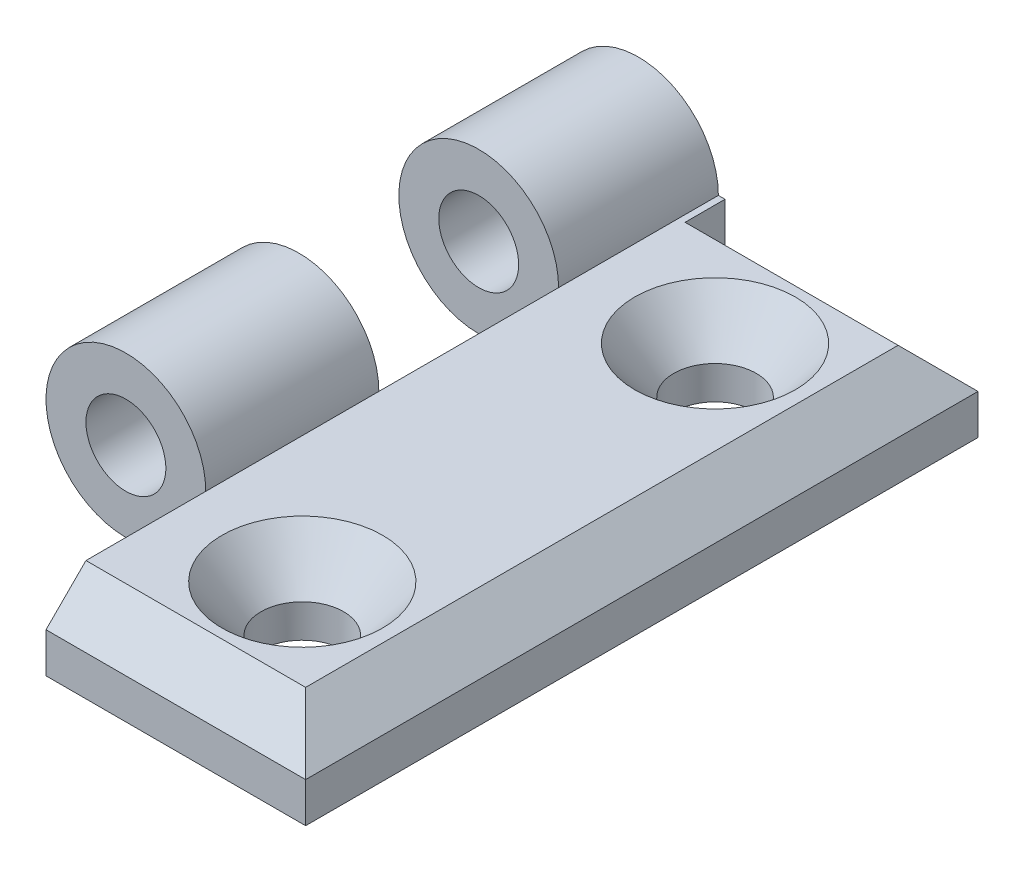
ISO-10303-21;
HEADER;
FILE_DESCRIPTION(('STEP AP214'),'2;1');
FILE_NAME('part.step','',(''),(''),'','','');
FILE_SCHEMA(('AUTOMOTIVE_DESIGN { 1 0 10303 214 1 1 1 1 }'));
ENDSEC;
DATA;
#1=APPLICATION_CONTEXT('core data for automotive mechanical design processes');
#2=APPLICATION_PROTOCOL_DEFINITION('international standard','automotive_design',2000,#1);
#3=PRODUCT_CONTEXT('',#1,'mechanical');
#4=PRODUCT('Part','Part','',(#3));
#5=PRODUCT_RELATED_PRODUCT_CATEGORY('part','',(#4));
#6=PRODUCT_DEFINITION_FORMATION('','',#4);
#7=PRODUCT_DEFINITION_CONTEXT('part definition',#1,'design');
#8=PRODUCT_DEFINITION('design','',#6,#7);
#9=PRODUCT_DEFINITION_SHAPE('','',#8);
#10=(LENGTH_UNIT() NAMED_UNIT(*) SI_UNIT(.MILLI.,.METRE.));
#11=(NAMED_UNIT(*) PLANE_ANGLE_UNIT() SI_UNIT($,.RADIAN.));
#12=(NAMED_UNIT(*) SI_UNIT($,.STERADIAN.) SOLID_ANGLE_UNIT());
#13=UNCERTAINTY_MEASURE_WITH_UNIT(LENGTH_MEASURE(1.E-05),#10,'distance_accuracy_value','');
#14=(GEOMETRIC_REPRESENTATION_CONTEXT(3) GLOBAL_UNCERTAINTY_ASSIGNED_CONTEXT((#13)) GLOBAL_UNIT_ASSIGNED_CONTEXT((#10,
#11,#12)) REPRESENTATION_CONTEXT('',''));
#15=CARTESIAN_POINT('',(0.,0.,0.));
#16=DIRECTION('',(0.,0.,1.));
#17=DIRECTION('',(1.,0.,0.));
#18=AXIS2_PLACEMENT_3D('',#15,#16,#17);
#19=CARTESIAN_POINT('',(0.,6.,50.5));
#20=DIRECTION('',(0.,-1.,0.));
#21=DIRECTION('',(0.,0.,-1.));
#22=AXIS2_PLACEMENT_3D('',#19,#20,#21);
#23=PLANE('',#22);
#24=DIRECTION('',(0.,0.,-1.));
#25=VECTOR('',#24,1.);
#26=CARTESIAN_POINT('',(6.00000000000001,6.,50.5));
#27=LINE('',#26,#25);
#28=CARTESIAN_POINT('',(6.00000000000001,6.,47.5));
#29=VERTEX_POINT('',#28);
#30=CARTESIAN_POINT('',(6.00000000000001,6.,38.5));
#31=VERTEX_POINT('',#30);
#32=EDGE_CURVE('E169',#29,#31,#27,.T.);
#33=ORIENTED_EDGE('',*,*,#32,.F.);
#34=DIRECTION('',(1.,0.,0.));
#35=VECTOR('',#34,1.);
#36=CARTESIAN_POINT('',(25.5,6.,47.5));
#37=LINE('',#36,#35);
#38=CARTESIAN_POINT('',(22.5,6.,47.5));
#39=VERTEX_POINT('',#38);
#40=EDGE_CURVE('E54',#29,#39,#37,.T.);
#41=ORIENTED_EDGE('',*,*,#40,.T.);
#42=DIRECTION('',(0.,0.,-1.));
#43=VECTOR('',#42,1.);
#44=CARTESIAN_POINT('',(22.5,6.,50.5));
#45=LINE('',#44,#43);
#46=CARTESIAN_POINT('',(22.5,6.,3.));
#47=VERTEX_POINT('',#46);
#48=EDGE_CURVE('E58',#39,#47,#45,.T.);
#49=ORIENTED_EDGE('',*,*,#48,.T.);
#50=DIRECTION('',(-1.,0.,0.));
#51=VECTOR('',#50,1.);
#52=CARTESIAN_POINT('',(57.,6.,3.));
#53=LINE('',#52,#51);
#54=CARTESIAN_POINT('',(6.5,6.,3.));
#55=VERTEX_POINT('',#54);
#56=EDGE_CURVE('E138',#47,#55,#53,.T.);
#57=ORIENTED_EDGE('',*,*,#56,.T.);
#58=DIRECTION('',(0.,0.,1.));
#59=VECTOR('',#58,1.);
#60=CARTESIAN_POINT('',(6.5,6.,0.));
#61=LINE('',#60,#59);
#62=CARTESIAN_POINT('',(6.5,6.,0.));
#63=VERTEX_POINT('',#62);
#64=EDGE_CURVE('E126',#63,#55,#61,.T.);
#65=ORIENTED_EDGE('',*,*,#64,.F.);
#66=DIRECTION('',(-1.,0.,0.));
#67=VECTOR('',#66,1.);
#68=CARTESIAN_POINT('',(0.,6.,0.));
#69=LINE('',#68,#67);
#70=CARTESIAN_POINT('',(6.00000000000001,6.,0.));
#71=VERTEX_POINT('',#70);
#72=EDGE_CURVE('E136',#63,#71,#69,.T.);
#73=ORIENTED_EDGE('',*,*,#72,.T.);
#74=CARTESIAN_POINT('',(6.00000000000001,6.,12.));
#75=VERTEX_POINT('',#74);
#76=EDGE_CURVE('E173',#75,#71,#27,.T.);
#77=ORIENTED_EDGE('',*,*,#76,.F.);
#78=DIRECTION('',(0.,0.,-1.));
#79=VECTOR('',#78,1.);
#80=CARTESIAN_POINT('',(6.,6.,50.5));
#81=LINE('',#80,#79);
#82=CARTESIAN_POINT('',(6.,6.,25.5));
#83=VERTEX_POINT('',#82);
#84=EDGE_CURVE('E196',#83,#75,#81,.T.);
#85=ORIENTED_EDGE('',*,*,#84,.F.);
#86=EDGE_CURVE('E172',#31,#83,#27,.T.);
#87=ORIENTED_EDGE('',*,*,#86,.F.);
#88=EDGE_LOOP('',(#33,#41,#49,#57,#65,#73,#77,#85,#87));
#89=FACE_BOUND('',#88,.T.);
#90=CARTESIAN_POINT('',(15.5,6.,9.75));
#91=DIRECTION('',(0.,-1.,0.));
#92=DIRECTION('',(0.,0.,-1.));
#93=AXIS2_PLACEMENT_3D('',#90,#91,#92);
#94=CIRCLE('',#93,6.03684870912049);
#95=CARTESIAN_POINT('',(15.5,6.,3.71315129087951));
#96=VERTEX_POINT('',#95);
#97=EDGE_CURVE('E221',#96,#96,#94,.F.);
#98=ORIENTED_EDGE('',*,*,#97,.F.);
#99=EDGE_LOOP('',(#98));
#100=FACE_BOUND('',#99,.T.);
#101=CARTESIAN_POINT('',(15.5,6.,40.75));
#102=DIRECTION('',(0.,-1.,0.));
#103=DIRECTION('',(0.,0.,-1.));
#104=AXIS2_PLACEMENT_3D('',#101,#102,#103);
#105=CIRCLE('',#104,6.03684870912049);
#106=CARTESIAN_POINT('',(15.5,6.,34.7131512908795));
#107=VERTEX_POINT('',#106);
#108=EDGE_CURVE('E343',#107,#107,#105,.T.);
#109=ORIENTED_EDGE('',*,*,#108,.T.);
#110=EDGE_LOOP('',(#109));
#111=FACE_BOUND('',#110,.T.);
#112=ADVANCED_FACE('F38',(#89,#100,#111),#23,.F.);
#113=CARTESIAN_POINT('',(15.5,-1.2E-05,9.75));
#114=DIRECTION('',(0.,1.,0.));
#115=DIRECTION('',(0.,0.,1.));
#116=AXIS2_PLACEMENT_3D('',#113,#114,#115);
#117=CYLINDRICAL_SURFACE('',#116,3.1);
#118=CARTESIAN_POINT('',(15.5,0.,9.75));
#119=DIRECTION('',(0.,-1.,0.));
#120=DIRECTION('',(1.,0.,0.));
#121=AXIS2_PLACEMENT_3D('',#118,#119,#120);
#122=CIRCLE('',#121,3.1);
#123=CARTESIAN_POINT('',(15.5,0.,12.85));
#124=VERTEX_POINT('',#123);
#125=EDGE_CURVE('E150',#124,#124,#122,.T.);
#126=CARTESIAN_POINT('',(15.5,2.5,9.75));
#127=DIRECTION('',(0.,1.,0.));
#128=DIRECTION('',(0.,0.,1.));
#129=AXIS2_PLACEMENT_3D('',#126,#127,#128);
#130=CIRCLE('',#129,3.1);
#131=CARTESIAN_POINT('',(15.5,2.5,12.85));
#132=VERTEX_POINT('',#131);
#133=EDGE_CURVE('E340',#132,#132,#130,.T.);
#134=CARTESIAN_POINT('',(15.5,0.,12.85));
#135=CARTESIAN_POINT('',(15.5,0.0260416666666648,12.85));
#136=CARTESIAN_POINT('',(15.5,0.0520833333333315,12.85));
#137=CARTESIAN_POINT('',(15.5,0.104166666666665,12.85));
#138=CARTESIAN_POINT('',(15.5,0.130208333333332,12.85));
#139=CARTESIAN_POINT('',(15.5,0.182291666666665,12.85));
#140=CARTESIAN_POINT('',(15.5,0.208333333333332,12.85));
#141=CARTESIAN_POINT('',(15.5,0.260416666666665,12.85));
#142=CARTESIAN_POINT('',(15.5,0.286458333333332,12.85));
#143=CARTESIAN_POINT('',(15.5,0.338541666666665,12.85));
#144=CARTESIAN_POINT('',(15.5,0.364583333333332,12.85));
#145=CARTESIAN_POINT('',(15.5,0.416666666666665,12.85));
#146=CARTESIAN_POINT('',(15.5,0.442708333333332,12.85));
#147=CARTESIAN_POINT('',(15.5,0.494791666666665,12.85));
#148=CARTESIAN_POINT('',(15.5,0.520833333333332,12.85));
#149=CARTESIAN_POINT('',(15.5,0.572916666666665,12.85));
#150=CARTESIAN_POINT('',(15.5,0.598958333333332,12.85));
#151=CARTESIAN_POINT('',(15.5,0.651041666666665,12.85));
#152=CARTESIAN_POINT('',(15.5,0.677083333333332,12.85));
#153=CARTESIAN_POINT('',(15.5,0.729166666666665,12.85));
#154=CARTESIAN_POINT('',(15.5,0.755208333333332,12.85));
#155=CARTESIAN_POINT('',(15.5,0.807291666666666,12.85));
#156=CARTESIAN_POINT('',(15.5,0.833333333333332,12.85));
#157=CARTESIAN_POINT('',(15.5,0.885416666666666,12.85));
#158=CARTESIAN_POINT('',(15.5,0.911458333333332,12.85));
#159=CARTESIAN_POINT('',(15.5,0.963541666666666,12.85));
#160=CARTESIAN_POINT('',(15.5,0.989583333333332,12.85));
#161=CARTESIAN_POINT('',(15.5,1.04166666666667,12.85));
#162=CARTESIAN_POINT('',(15.5,1.06770833333333,12.85));
#163=CARTESIAN_POINT('',(15.5,1.11979166666667,12.85));
#164=CARTESIAN_POINT('',(15.5,1.14583333333333,12.85));
#165=CARTESIAN_POINT('',(15.5,1.19791666666667,12.85));
#166=CARTESIAN_POINT('',(15.5,1.22395833333333,12.85));
#167=CARTESIAN_POINT('',(15.5,1.27604166666667,12.85));
#168=CARTESIAN_POINT('',(15.5,1.30208333333333,12.85));
#169=CARTESIAN_POINT('',(15.5,1.35416666666667,12.85));
#170=CARTESIAN_POINT('',(15.5,1.38020833333333,12.85));
#171=CARTESIAN_POINT('',(15.5,1.43229166666667,12.85));
#172=CARTESIAN_POINT('',(15.5,1.45833333333333,12.85));
#173=CARTESIAN_POINT('',(15.5,1.51041666666667,12.85));
#174=CARTESIAN_POINT('',(15.5,1.53645833333333,12.85));
#175=CARTESIAN_POINT('',(15.5,1.58854166666667,12.85));
#176=CARTESIAN_POINT('',(15.5,1.61458333333333,12.85));
#177=CARTESIAN_POINT('',(15.5,1.66666666666667,12.85));
#178=CARTESIAN_POINT('',(15.5,1.69270833333333,12.85));
#179=CARTESIAN_POINT('',(15.5,1.74479166666667,12.85));
#180=CARTESIAN_POINT('',(15.5,1.77083333333333,12.85));
#181=CARTESIAN_POINT('',(15.5,1.82291666666667,12.85));
#182=CARTESIAN_POINT('',(15.5,1.84895833333333,12.85));
#183=CARTESIAN_POINT('',(15.5,1.90104166666667,12.85));
#184=CARTESIAN_POINT('',(15.5,1.92708333333333,12.85));
#185=CARTESIAN_POINT('',(15.5,1.97916666666667,12.85));
#186=CARTESIAN_POINT('',(15.5,2.00520833333333,12.85));
#187=CARTESIAN_POINT('',(15.5,2.05729166666667,12.85));
#188=CARTESIAN_POINT('',(15.5,2.08333333333333,12.85));
#189=CARTESIAN_POINT('',(15.5,2.13541666666667,12.85));
#190=CARTESIAN_POINT('',(15.5,2.16145833333333,12.85));
#191=CARTESIAN_POINT('',(15.5,2.21354166666667,12.85));
#192=CARTESIAN_POINT('',(15.5,2.23958333333333,12.85));
#193=CARTESIAN_POINT('',(15.5,2.29166666666667,12.85));
#194=CARTESIAN_POINT('',(15.5,2.31770833333333,12.85));
#195=CARTESIAN_POINT('',(15.5,2.36979166666667,12.85));
#196=CARTESIAN_POINT('',(15.5,2.39583333333333,12.85));
#197=CARTESIAN_POINT('',(15.5,2.44791666666667,12.85));
#198=CARTESIAN_POINT('',(15.5,2.47395833333333,12.85));
#199=CARTESIAN_POINT('',(15.5,2.5,12.85));
#200=B_SPLINE_CURVE_WITH_KNOTS('',3,(#134,#135,#136,#137,#138,#139,#140,#141,#142,#143,#144,
#145,#146,#147,#148,#149,#150,#151,#152,#153,#154,#155,#156,#157,#158,#159,#160,#161,#162,#163,
#164,#165,#166,#167,#168,#169,#170,#171,#172,#173,#174,#175,#176,#177,#178,#179,#180,#181,#182,
#183,#184,#185,#186,#187,#188,#189,#190,#191,#192,#193,#194,#195,#196,#197,#198,#199),
.UNSPECIFIED.,.F.,.F.,(4,2,2,2,2,2,2,2,2,2,2,2,2,2,2,2,2,2,2,2,2,2,2,2,2,2,2,2,2,2,2,2,4),(0.,
0.0781250000000001,0.15625,0.234375,0.3125,0.390625,0.46875,0.546875,0.625000000000001,
0.703125000000001,0.781250000000001,0.859375000000001,0.937500000000001,1.015625,1.09375,
1.171875,1.25,1.328125,1.40625,1.484375,1.5625,1.640625,1.71875,1.796875,1.875,1.953125,2.03125,
2.109375,2.1875,2.265625,2.34375,2.421875,2.5),.UNSPECIFIED.);
#201=EDGE_CURVE('BSEAM287',#124,#132,#200,.T.);
#202=ORIENTED_EDGE('',*,*,#125,.T.);
#203=ORIENTED_EDGE('',*,*,#133,.T.);
#204=ORIENTED_EDGE('',*,*,#201,.T.);
#205=ORIENTED_EDGE('',*,*,#201,.F.);
#206=EDGE_LOOP('',(#202,#204,#203,#205));
#207=FACE_BOUND('',#206,.T.);
#208=ADVANCED_FACE('F287',(#207),#117,.F.);
#209=CARTESIAN_POINT('',(25.5,0.,50.5));
#210=DIRECTION('',(-1.,0.,0.));
#211=DIRECTION('',(0.,0.,1.));
#212=AXIS2_PLACEMENT_3D('',#209,#210,#211);
#213=PLANE('',#212);
#214=DIRECTION('',(0.,1.,0.));
#215=VECTOR('',#214,1.);
#216=CARTESIAN_POINT('',(25.5,0.,0.));
#217=LINE('',#216,#215);
#218=CARTESIAN_POINT('',(25.5,0.,0.));
#219=VERTEX_POINT('',#218);
#220=CARTESIAN_POINT('',(25.5,3.,0.));
#221=VERTEX_POINT('',#220);
#222=EDGE_CURVE('E157',#219,#221,#217,.T.);
#223=ORIENTED_EDGE('',*,*,#222,.T.);
#224=DIRECTION('',(0.,0.,1.));
#225=VECTOR('',#224,1.);
#226=CARTESIAN_POINT('',(25.5,2.99999999999999,50.5));
#227=LINE('',#226,#225);
#228=CARTESIAN_POINT('',(25.5,2.99999999999999,50.5));
#229=VERTEX_POINT('',#228);
#230=EDGE_CURVE('E11',#221,#229,#227,.T.);
#231=ORIENTED_EDGE('',*,*,#230,.T.);
#232=DIRECTION('',(0.,1.,0.));
#233=VECTOR('',#232,1.);
#234=CARTESIAN_POINT('',(25.5,0.,50.5));
#235=LINE('',#234,#233);
#236=CARTESIAN_POINT('',(25.5,0.,50.5));
#237=VERTEX_POINT('',#236);
#238=EDGE_CURVE('E153',#237,#229,#235,.T.);
#239=ORIENTED_EDGE('',*,*,#238,.F.);
#240=DIRECTION('',(0.,0.,-1.));
#241=VECTOR('',#240,1.);
#242=CARTESIAN_POINT('',(25.5,0.,50.5));
#243=LINE('',#242,#241);
#244=EDGE_CURVE('E164',#237,#219,#243,.T.);
#245=ORIENTED_EDGE('',*,*,#244,.T.);
#246=EDGE_LOOP('',(#223,#231,#239,#245));
#247=FACE_BOUND('',#246,.T.);
#248=ADVANCED_FACE('F214',(#247),#213,.F.);
#249=CARTESIAN_POINT('',(0.,0.,0.));
#250=DIRECTION('',(0.,0.,1.));
#251=DIRECTION('',(1.,0.,0.));
#252=AXIS2_PLACEMENT_3D('',#249,#250,#251);
#253=PLANE('',#252);
#254=CARTESIAN_POINT('',(0.,6.,0.));
#255=DIRECTION('',(0.,0.,1.));
#256=DIRECTION('',(1.,0.,0.));
#257=AXIS2_PLACEMENT_3D('',#254,#255,#256);
#258=CIRCLE('',#257,3.);
#259=CARTESIAN_POINT('',(3.,6.,0.));
#260=VERTEX_POINT('',#259);
#261=EDGE_CURVE('E160',#260,#260,#258,.T.);
#262=ORIENTED_EDGE('',*,*,#261,.T.);
#263=EDGE_LOOP('',(#262));
#264=FACE_BOUND('',#263,.T.);
#265=DIRECTION('',(-1.,0.,0.));
#266=VECTOR('',#265,1.);
#267=CARTESIAN_POINT('',(0.,3.,0.));
#268=LINE('',#267,#266);
#269=CARTESIAN_POINT('',(6.5,3.,0.));
#270=VERTEX_POINT('',#269);
#271=EDGE_CURVE('E194',#221,#270,#268,.T.);
#272=ORIENTED_EDGE('',*,*,#271,.F.);
#273=ORIENTED_EDGE('',*,*,#222,.F.);
#274=DIRECTION('',(-1.,0.,0.));
#275=VECTOR('',#274,1.);
#276=CARTESIAN_POINT('',(0.,0.,0.));
#277=LINE('',#276,#275);
#278=CARTESIAN_POINT('',(0.,0.,0.));
#279=VERTEX_POINT('',#278);
#280=EDGE_CURVE('E147',#219,#279,#277,.T.);
#281=ORIENTED_EDGE('',*,*,#280,.T.);
#282=CARTESIAN_POINT('',(0.,6.,0.));
#283=DIRECTION('',(0.,0.,1.));
#284=DIRECTION('',(1.,0.,0.));
#285=AXIS2_PLACEMENT_3D('',#282,#283,#284);
#286=CIRCLE('',#285,6.00000000000001);
#287=EDGE_CURVE('E144',#71,#279,#286,.T.);
#288=ORIENTED_EDGE('',*,*,#287,.F.);
#289=ORIENTED_EDGE('',*,*,#72,.F.);
#290=DIRECTION('',(0.,1.,0.));
#291=VECTOR('',#290,1.);
#292=CARTESIAN_POINT('',(6.5,0.,0.));
#293=LINE('',#292,#291);
#294=EDGE_CURVE('E123',#270,#63,#293,.T.);
#295=ORIENTED_EDGE('',*,*,#294,.F.);
#296=EDGE_LOOP('',(#272,#273,#281,#288,#289,#295));
#297=FACE_BOUND('',#296,.T.);
#298=ADVANCED_FACE('F141',(#264,#297),#253,.F.);
#299=CARTESIAN_POINT('',(0.,6.,50.5));
#300=DIRECTION('',(0.,0.,-1.));
#301=DIRECTION('',(-1.,0.,0.));
#302=AXIS2_PLACEMENT_3D('',#299,#300,#301);
#303=CYLINDRICAL_SURFACE('',#302,6.00000000000001);
#304=DIRECTION('',(0.,0.,-1.));
#305=VECTOR('',#304,1.);
#306=CARTESIAN_POINT('',(0.,0.,50.5));
#307=LINE('',#306,#305);
#308=CARTESIAN_POINT('',(0.,0.,12.));
#309=VERTEX_POINT('',#308);
#310=EDGE_CURVE('E166',#309,#279,#307,.T.);
#311=ORIENTED_EDGE('',*,*,#310,.F.);
#312=CARTESIAN_POINT('',(0.,6.,12.));
#313=DIRECTION('',(0.,0.,-1.));
#314=DIRECTION('',(-1.,0.,0.));
#315=AXIS2_PLACEMENT_3D('',#312,#313,#314);
#316=CIRCLE('',#315,6.00000000000001);
#317=EDGE_CURVE('E248',#309,#75,#316,.T.);
#318=ORIENTED_EDGE('',*,*,#317,.T.);
#319=ORIENTED_EDGE('',*,*,#76,.T.);
#320=ORIENTED_EDGE('',*,*,#287,.T.);
#321=EDGE_LOOP('',(#311,#318,#319,#320));
#322=FACE_BOUND('',#321,.T.);
#323=ADVANCED_FACE('F256',(#322),#303,.T.);
#324=CARTESIAN_POINT('',(0.,6.,50.5));
#325=DIRECTION('',(0.,0.,-1.));
#326=DIRECTION('',(-1.,0.,0.));
#327=AXIS2_PLACEMENT_3D('',#324,#325,#326);
#328=CYLINDRICAL_SURFACE('',#327,3.);
#329=CARTESIAN_POINT('',(0.,6.,12.));
#330=DIRECTION('',(0.,0.,-1.));
#331=DIRECTION('',(-1.,0.,0.));
#332=AXIS2_PLACEMENT_3D('',#329,#330,#331);
#333=CIRCLE('',#332,3.);
#334=CARTESIAN_POINT('',(-3.,6.,12.));
#335=VERTEX_POINT('',#334);
#336=EDGE_CURVE('E187',#335,#335,#333,.T.);
#337=ORIENTED_EDGE('',*,*,#336,.F.);
#338=EDGE_LOOP('',(#337));
#339=FACE_BOUND('',#338,.T.);
#340=ORIENTED_EDGE('',*,*,#261,.F.);
#341=EDGE_LOOP('',(#340));
#342=FACE_BOUND('',#341,.T.);
#343=ADVANCED_FACE('F459',(#339,#342),#328,.F.);
#344=ORIENTED_EDGE('',*,*,#86,.T.);
#345=CARTESIAN_POINT('',(0.,6.,25.5));
#346=DIRECTION('',(0.,0.,1.));
#347=DIRECTION('',(1.,0.,0.));
#348=AXIS2_PLACEMENT_3D('',#345,#346,#347);
#349=CIRCLE('',#348,6.00000000000001);
#350=CARTESIAN_POINT('',(0.,0.,25.5));
#351=VERTEX_POINT('',#350);
#352=EDGE_CURVE('E191',#83,#351,#349,.T.);
#353=ORIENTED_EDGE('',*,*,#352,.T.);
#354=CARTESIAN_POINT('',(0.,0.,38.5));
#355=VERTEX_POINT('',#354);
#356=EDGE_CURVE('E168',#355,#351,#307,.T.);
#357=ORIENTED_EDGE('',*,*,#356,.F.);
#358=CARTESIAN_POINT('',(0.,6.,38.5));
#359=DIRECTION('',(0.,0.,-1.));
#360=DIRECTION('',(-1.,0.,0.));
#361=AXIS2_PLACEMENT_3D('',#358,#359,#360);
#362=CIRCLE('',#361,6.00000000000001);
#363=EDGE_CURVE('E186',#355,#31,#362,.T.);
#364=ORIENTED_EDGE('',*,*,#363,.T.);
#365=EDGE_LOOP('',(#344,#353,#357,#364));
#366=FACE_BOUND('',#365,.T.);
#367=ADVANCED_FACE('F263',(#366),#303,.T.);
#368=CARTESIAN_POINT('',(0.,0.,50.5));
#369=DIRECTION('',(0.,-1.,0.));
#370=DIRECTION('',(1.,0.,0.));
#371=AXIS2_PLACEMENT_3D('',#368,#369,#370);
#372=PLANE('',#371);
#373=CARTESIAN_POINT('',(15.5,0.,40.75));
#374=DIRECTION('',(0.,-1.,0.));
#375=DIRECTION('',(1.,0.,0.));
#376=AXIS2_PLACEMENT_3D('',#373,#374,#375);
#377=CIRCLE('',#376,3.1);
#378=CARTESIAN_POINT('',(15.5,0.,43.85));
#379=VERTEX_POINT('',#378);
#380=EDGE_CURVE('E145',#379,#379,#377,.T.);
#381=ORIENTED_EDGE('',*,*,#380,.F.);
#382=EDGE_LOOP('',(#381));
#383=FACE_BOUND('',#382,.T.);
#384=ORIENTED_EDGE('',*,*,#125,.F.);
#385=EDGE_LOOP('',(#384));
#386=FACE_BOUND('',#385,.T.);
#387=DIRECTION('',(1.,0.,0.));
#388=VECTOR('',#387,1.);
#389=CARTESIAN_POINT('',(0.,0.,12.));
#390=LINE('',#389,#388);
#391=CARTESIAN_POINT('',(6.00000000000001,0.,12.));
#392=VERTEX_POINT('',#391);
#393=EDGE_CURVE('E190',#309,#392,#390,.T.);
#394=ORIENTED_EDGE('',*,*,#393,.F.);
#395=ORIENTED_EDGE('',*,*,#310,.T.);
#396=ORIENTED_EDGE('',*,*,#280,.F.);
#397=ORIENTED_EDGE('',*,*,#244,.F.);
#398=DIRECTION('',(-1.,0.,0.));
#399=VECTOR('',#398,1.);
#400=CARTESIAN_POINT('',(0.,0.,50.5));
#401=LINE('',#400,#399);
#402=CARTESIAN_POINT('',(6.00000000000001,0.,50.5));
#403=VERTEX_POINT('',#402);
#404=EDGE_CURVE('E163',#237,#403,#401,.T.);
#405=ORIENTED_EDGE('',*,*,#404,.T.);
#406=DIRECTION('',(0.,0.,1.));
#407=VECTOR('',#406,1.);
#408=CARTESIAN_POINT('',(6.00000000000001,0.,50.5));
#409=LINE('',#408,#407);
#410=CARTESIAN_POINT('',(6.00000000000001,0.,38.5));
#411=VERTEX_POINT('',#410);
#412=EDGE_CURVE('E181',#411,#403,#409,.T.);
#413=ORIENTED_EDGE('',*,*,#412,.F.);
#414=DIRECTION('',(1.,0.,0.));
#415=VECTOR('',#414,1.);
#416=CARTESIAN_POINT('',(0.,0.,38.5));
#417=LINE('',#416,#415);
#418=EDGE_CURVE('E180',#355,#411,#417,.T.);
#419=ORIENTED_EDGE('',*,*,#418,.F.);
#420=ORIENTED_EDGE('',*,*,#356,.T.);
#421=DIRECTION('',(-1.,0.,0.));
#422=VECTOR('',#421,1.);
#423=CARTESIAN_POINT('',(0.,0.,25.5));
#424=LINE('',#423,#422);
#425=CARTESIAN_POINT('',(6.00000000000001,0.,25.5));
#426=VERTEX_POINT('',#425);
#427=EDGE_CURVE('E185',#426,#351,#424,.T.);
#428=ORIENTED_EDGE('',*,*,#427,.F.);
#429=DIRECTION('',(0.,0.,1.));
#430=VECTOR('',#429,1.);
#431=CARTESIAN_POINT('',(6.00000000000001,0.,50.5));
#432=LINE('',#431,#430);
#433=EDGE_CURVE('E176',#392,#426,#432,.T.);
#434=ORIENTED_EDGE('',*,*,#433,.F.);
#435=EDGE_LOOP('',(#394,#395,#396,#397,#405,#413,#419,#420,#428,#434));
#436=FACE_BOUND('',#435,.T.);
#437=ADVANCED_FACE('F252',(#383,#386,#436),#372,.T.);
#438=CARTESIAN_POINT('',(0.,0.,50.5));
#439=DIRECTION('',(0.,0.,1.));
#440=DIRECTION('',(1.,0.,0.));
#441=AXIS2_PLACEMENT_3D('',#438,#439,#440);
#442=PLANE('',#441);
#443=ORIENTED_EDGE('',*,*,#238,.T.);
#444=DIRECTION('',(-1.,0.,0.));
#445=VECTOR('',#444,1.);
#446=CARTESIAN_POINT('',(6.00000000000001,2.99999999999999,50.5));
#447=LINE('',#446,#445);
#448=CARTESIAN_POINT('',(6.00000000000001,2.99999999999999,50.5));
#449=VERTEX_POINT('',#448);
#450=EDGE_CURVE('E199',#229,#449,#447,.T.);
#451=ORIENTED_EDGE('',*,*,#450,.T.);
#452=DIRECTION('',(0.,1.,0.));
#453=VECTOR('',#452,1.);
#454=CARTESIAN_POINT('',(6.00000000000001,0.,50.5));
#455=LINE('',#454,#453);
#456=EDGE_CURVE('E171',#403,#449,#455,.T.);
#457=ORIENTED_EDGE('',*,*,#456,.F.);
#458=ORIENTED_EDGE('',*,*,#404,.F.);
#459=EDGE_LOOP('',(#443,#451,#457,#458));
#460=FACE_BOUND('',#459,.T.);
#461=ADVANCED_FACE('F225',(#460),#442,.T.);
#462=CARTESIAN_POINT('',(-22.1663856170267,-1.2E-05,38.5));
#463=DIRECTION('',(0.,0.,-1.));
#464=DIRECTION('',(-1.,0.,0.));
#465=AXIS2_PLACEMENT_3D('',#462,#463,#464);
#466=PLANE('',#465);
#467=CARTESIAN_POINT('',(0.,6.,38.5));
#468=DIRECTION('',(0.,0.,-1.));
#469=DIRECTION('',(-1.,0.,0.));
#470=AXIS2_PLACEMENT_3D('',#467,#468,#469);
#471=CIRCLE('',#470,3.);
#472=CARTESIAN_POINT('',(-3.,6.,38.5));
#473=VERTEX_POINT('',#472);
#474=EDGE_CURVE('E177',#473,#473,#471,.T.);
#475=ORIENTED_EDGE('',*,*,#474,.T.);
#476=EDGE_LOOP('',(#475));
#477=FACE_BOUND('',#476,.T.);
#478=ORIENTED_EDGE('',*,*,#418,.T.);
#479=DIRECTION('',(0.,1.,0.));
#480=VECTOR('',#479,1.);
#481=CARTESIAN_POINT('',(6.00000000000001,-1.2E-05,38.5));
#482=LINE('',#481,#480);
#483=EDGE_CURVE('E233',#411,#31,#482,.T.);
#484=ORIENTED_EDGE('',*,*,#483,.T.);
#485=ORIENTED_EDGE('',*,*,#363,.F.);
#486=EDGE_LOOP('',(#478,#484,#485));
#487=FACE_BOUND('',#486,.T.);
#488=ADVANCED_FACE('F274',(#477,#487),#466,.F.);
#489=CARTESIAN_POINT('',(6.00000000000001,-1.2E-05,58.2287270663082));
#490=DIRECTION('',(1.,0.,0.));
#491=DIRECTION('',(0.,0.,-1.));
#492=AXIS2_PLACEMENT_3D('',#489,#490,#491);
#493=PLANE('',#492);
#494=ORIENTED_EDGE('',*,*,#456,.T.);
#495=DIRECTION('',(0.,0.707106781186549,-0.707106781186546));
#496=VECTOR('',#495,1.);
#497=CARTESIAN_POINT('',(6.00000000000001,2.99999999999999,50.5));
#498=LINE('',#497,#496);
#499=EDGE_CURVE('E202',#449,#29,#498,.T.);
#500=ORIENTED_EDGE('',*,*,#499,.T.);
#501=ORIENTED_EDGE('',*,*,#32,.T.);
#502=ORIENTED_EDGE('',*,*,#483,.F.);
#503=ORIENTED_EDGE('',*,*,#412,.T.);
#504=EDGE_LOOP('',(#494,#500,#501,#502,#503));
#505=FACE_BOUND('',#504,.T.);
#506=ADVANCED_FACE('F229',(#505),#493,.F.);
#507=CARTESIAN_POINT('',(0.,6.,25.5));
#508=DIRECTION('',(0.,0.,1.));
#509=DIRECTION('',(1.,0.,0.));
#510=AXIS2_PLACEMENT_3D('',#507,#508,#509);
#511=CIRCLE('',#510,3.);
#512=CARTESIAN_POINT('',(3.,6.,25.5));
#513=VERTEX_POINT('',#512);
#514=EDGE_CURVE('E182',#513,#513,#511,.T.);
#515=ORIENTED_EDGE('',*,*,#514,.F.);
#516=EDGE_LOOP('',(#515));
#517=FACE_BOUND('',#516,.T.);
#518=ORIENTED_EDGE('',*,*,#474,.F.);
#519=EDGE_LOOP('',(#518));
#520=FACE_BOUND('',#519,.T.);
#521=ADVANCED_FACE('F282',(#517,#520),#328,.F.);
#522=CARTESIAN_POINT('',(-22.6736780997785,-1.2E-05,12.));
#523=DIRECTION('',(0.,0.,-1.));
#524=DIRECTION('',(-1.,0.,0.));
#525=AXIS2_PLACEMENT_3D('',#522,#523,#524);
#526=PLANE('',#525);
#527=ORIENTED_EDGE('',*,*,#336,.T.);
#528=EDGE_LOOP('',(#527));
#529=FACE_BOUND('',#528,.T.);
#530=ORIENTED_EDGE('',*,*,#393,.T.);
#531=DIRECTION('',(0.,1.,0.));
#532=VECTOR('',#531,1.);
#533=CARTESIAN_POINT('',(6.00000000000001,-1.2E-05,12.));
#534=LINE('',#533,#532);
#535=EDGE_CURVE('E237',#392,#75,#534,.T.);
#536=ORIENTED_EDGE('',*,*,#535,.T.);
#537=ORIENTED_EDGE('',*,*,#317,.F.);
#538=EDGE_LOOP('',(#530,#536,#537));
#539=FACE_BOUND('',#538,.T.);
#540=ADVANCED_FACE('F316',(#529,#539),#526,.F.);
#541=CARTESIAN_POINT('',(-22.6736780997785,-1.2E-05,25.5));
#542=DIRECTION('',(0.,0.,1.));
#543=DIRECTION('',(1.,0.,0.));
#544=AXIS2_PLACEMENT_3D('',#541,#542,#543);
#545=PLANE('',#544);
#546=ORIENTED_EDGE('',*,*,#514,.T.);
#547=EDGE_LOOP('',(#546));
#548=FACE_BOUND('',#547,.T.);
#549=DIRECTION('',(0.,1.,0.));
#550=VECTOR('',#549,1.);
#551=CARTESIAN_POINT('',(6.00000000000001,-1.2E-05,25.5));
#552=LINE('',#551,#550);
#553=EDGE_CURVE('E268',#426,#83,#552,.T.);
#554=ORIENTED_EDGE('',*,*,#553,.F.);
#555=ORIENTED_EDGE('',*,*,#427,.T.);
#556=ORIENTED_EDGE('',*,*,#352,.F.);
#557=EDGE_LOOP('',(#554,#555,#556));
#558=FACE_BOUND('',#557,.T.);
#559=ADVANCED_FACE('F267',(#548,#558),#545,.F.);
#560=CARTESIAN_POINT('',(6.00000000000001,-1.2E-05,25.5));
#561=DIRECTION('',(1.,0.,0.));
#562=DIRECTION('',(0.,0.,-1.));
#563=AXIS2_PLACEMENT_3D('',#560,#561,#562);
#564=PLANE('',#563);
#565=ORIENTED_EDGE('',*,*,#84,.T.);
#566=ORIENTED_EDGE('',*,*,#535,.F.);
#567=ORIENTED_EDGE('',*,*,#433,.T.);
#568=ORIENTED_EDGE('',*,*,#553,.T.);
#569=EDGE_LOOP('',(#565,#566,#567,#568));
#570=FACE_BOUND('',#569,.T.);
#571=ADVANCED_FACE('F270',(#570),#564,.F.);
#572=CARTESIAN_POINT('',(15.5,-1.2E-05,40.75));
#573=DIRECTION('',(0.,1.,0.));
#574=DIRECTION('',(0.,0.,1.));
#575=AXIS2_PLACEMENT_3D('',#572,#573,#574);
#576=CYLINDRICAL_SURFACE('',#575,3.1);
#577=CARTESIAN_POINT('',(15.5,2.5,40.75));
#578=DIRECTION('',(0.,-1.,0.));
#579=DIRECTION('',(0.,0.,-1.));
#580=AXIS2_PLACEMENT_3D('',#577,#578,#579);
#581=CIRCLE('',#580,3.1);
#582=CARTESIAN_POINT('',(15.5,2.5,43.85));
#583=VERTEX_POINT('',#582);
#584=EDGE_CURVE('E331',#583,#583,#581,.T.);
#585=CARTESIAN_POINT('',(15.5,2.5,43.85));
#586=CARTESIAN_POINT('',(15.5,2.47395833333333,43.85));
#587=CARTESIAN_POINT('',(15.5,2.44791666666667,43.85));
#588=CARTESIAN_POINT('',(15.5,2.39583333333333,43.85));
#589=CARTESIAN_POINT('',(15.5,2.36979166666667,43.85));
#590=CARTESIAN_POINT('',(15.5,2.31770833333333,43.85));
#591=CARTESIAN_POINT('',(15.5,2.29166666666667,43.85));
#592=CARTESIAN_POINT('',(15.5,2.23958333333333,43.85));
#593=CARTESIAN_POINT('',(15.5,2.21354166666667,43.85));
#594=CARTESIAN_POINT('',(15.5,2.16145833333333,43.85));
#595=CARTESIAN_POINT('',(15.5,2.13541666666667,43.85));
#596=CARTESIAN_POINT('',(15.5,2.08333333333333,43.85));
#597=CARTESIAN_POINT('',(15.5,2.05729166666667,43.85));
#598=CARTESIAN_POINT('',(15.5,2.00520833333333,43.85));
#599=CARTESIAN_POINT('',(15.5,1.97916666666667,43.85));
#600=CARTESIAN_POINT('',(15.5,1.92708333333333,43.85));
#601=CARTESIAN_POINT('',(15.5,1.90104166666667,43.85));
#602=CARTESIAN_POINT('',(15.5,1.84895833333333,43.85));
#603=CARTESIAN_POINT('',(15.5,1.82291666666667,43.85));
#604=CARTESIAN_POINT('',(15.5,1.77083333333333,43.85));
#605=CARTESIAN_POINT('',(15.5,1.74479166666667,43.85));
#606=CARTESIAN_POINT('',(15.5,1.69270833333333,43.85));
#607=CARTESIAN_POINT('',(15.5,1.66666666666667,43.85));
#608=CARTESIAN_POINT('',(15.5,1.61458333333333,43.85));
#609=CARTESIAN_POINT('',(15.5,1.58854166666667,43.85));
#610=CARTESIAN_POINT('',(15.5,1.53645833333333,43.85));
#611=CARTESIAN_POINT('',(15.5,1.51041666666667,43.85));
#612=CARTESIAN_POINT('',(15.5,1.45833333333333,43.85));
#613=CARTESIAN_POINT('',(15.5,1.43229166666667,43.85));
#614=CARTESIAN_POINT('',(15.5,1.38020833333333,43.85));
#615=CARTESIAN_POINT('',(15.5,1.35416666666667,43.85));
#616=CARTESIAN_POINT('',(15.5,1.30208333333333,43.85));
#617=CARTESIAN_POINT('',(15.5,1.27604166666667,43.85));
#618=CARTESIAN_POINT('',(15.5,1.22395833333333,43.85));
#619=CARTESIAN_POINT('',(15.5,1.19791666666667,43.85));
#620=CARTESIAN_POINT('',(15.5,1.14583333333333,43.85));
#621=CARTESIAN_POINT('',(15.5,1.11979166666667,43.85));
#622=CARTESIAN_POINT('',(15.5,1.06770833333333,43.85));
#623=CARTESIAN_POINT('',(15.5,1.04166666666667,43.85));
#624=CARTESIAN_POINT('',(15.5,0.989583333333333,43.85));
#625=CARTESIAN_POINT('',(15.5,0.963541666666666,43.85));
#626=CARTESIAN_POINT('',(15.5,0.911458333333332,43.85));
#627=CARTESIAN_POINT('',(15.5,0.885416666666666,43.85));
#628=CARTESIAN_POINT('',(15.5,0.833333333333332,43.85));
#629=CARTESIAN_POINT('',(15.5,0.807291666666666,43.85));
#630=CARTESIAN_POINT('',(15.5,0.755208333333332,43.85));
#631=CARTESIAN_POINT('',(15.5,0.729166666666666,43.85));
#632=CARTESIAN_POINT('',(15.5,0.677083333333332,43.85));
#633=CARTESIAN_POINT('',(15.5,0.651041666666665,43.85));
#634=CARTESIAN_POINT('',(15.5,0.598958333333332,43.85));
#635=CARTESIAN_POINT('',(15.5,0.572916666666665,43.85));
#636=CARTESIAN_POINT('',(15.5,0.520833333333332,43.85));
#637=CARTESIAN_POINT('',(15.5,0.494791666666665,43.85));
#638=CARTESIAN_POINT('',(15.5,0.442708333333332,43.85));
#639=CARTESIAN_POINT('',(15.5,0.416666666666665,43.85));
#640=CARTESIAN_POINT('',(15.5,0.364583333333332,43.85));
#641=CARTESIAN_POINT('',(15.5,0.338541666666665,43.85));
#642=CARTESIAN_POINT('',(15.5,0.286458333333332,43.85));
#643=CARTESIAN_POINT('',(15.5,0.260416666666665,43.85));
#644=CARTESIAN_POINT('',(15.5,0.208333333333332,43.85));
#645=CARTESIAN_POINT('',(15.5,0.182291666666665,43.85));
#646=CARTESIAN_POINT('',(15.5,0.130208333333331,43.85));
#647=CARTESIAN_POINT('',(15.5,0.104166666666665,43.85));
#648=CARTESIAN_POINT('',(15.5,0.0520833333333314,43.85));
#649=CARTESIAN_POINT('',(15.5,0.0260416666666647,43.85));
#650=CARTESIAN_POINT('',(15.5,0.,43.85));
#651=B_SPLINE_CURVE_WITH_KNOTS('',3,(#585,#586,#587,#588,#589,#590,#591,#592,#593,#594,#595,
#596,#597,#598,#599,#600,#601,#602,#603,#604,#605,#606,#607,#608,#609,#610,#611,#612,#613,#614,
#615,#616,#617,#618,#619,#620,#621,#622,#623,#624,#625,#626,#627,#628,#629,#630,#631,#632,#633,
#634,#635,#636,#637,#638,#639,#640,#641,#642,#643,#644,#645,#646,#647,#648,#649,#650),
.UNSPECIFIED.,.F.,.F.,(4,2,2,2,2,2,2,2,2,2,2,2,2,2,2,2,2,2,2,2,2,2,2,2,2,2,2,2,2,2,2,2,4),(0.,
0.0781250000000001,0.15625,0.234375,0.3125,0.390625,0.46875,0.546875,0.625,0.703125,0.78125,
0.859375000000001,0.937500000000001,1.015625,1.09375,1.171875,1.25,1.328125,1.40625,1.484375,
1.5625,1.640625,1.71875,1.796875,1.875,1.953125,2.03125,2.109375,2.1875,2.265625,2.34375,
2.421875,2.5),.UNSPECIFIED.);
#652=EDGE_CURVE('BSEAM312',#583,#379,#651,.T.);
#653=ORIENTED_EDGE('',*,*,#584,.F.);
#654=ORIENTED_EDGE('',*,*,#380,.T.);
#655=ORIENTED_EDGE('',*,*,#652,.T.);
#656=ORIENTED_EDGE('',*,*,#652,.F.);
#657=EDGE_LOOP('',(#653,#655,#654,#656));
#658=FACE_BOUND('',#657,.T.);
#659=ADVANCED_FACE('F312',(#658),#576,.F.);
#660=CARTESIAN_POINT('',(57.,1.5,-1.5));
#661=DIRECTION('',(0.,0.707106781186548,-0.707106781186547));
#662=DIRECTION('',(0.,0.707106781186547,0.707106781186548));
#663=AXIS2_PLACEMENT_3D('',#660,#661,#662);
#664=PLANE('',#663);
#665=ORIENTED_EDGE('',*,*,#56,.F.);
#666=DIRECTION('',(-0.577350269189624,0.577350269189627,0.577350269189627));
#667=VECTOR('',#666,1.);
#668=CARTESIAN_POINT('',(36.9999999999999,-8.49999999999998,-11.5));
#669=LINE('',#668,#667);
#670=EDGE_CURVE('E47',#47,#221,#669,.F.);
#671=ORIENTED_EDGE('',*,*,#670,.T.);
#672=ORIENTED_EDGE('',*,*,#271,.T.);
#673=DIRECTION('',(0.,-0.707106781186547,-0.707106781186548));
#674=VECTOR('',#673,1.);
#675=CARTESIAN_POINT('',(6.5,1.5,-1.5));
#676=LINE('',#675,#674);
#677=EDGE_CURVE('E128',#55,#270,#676,.T.);
#678=ORIENTED_EDGE('',*,*,#677,.F.);
#679=EDGE_LOOP('',(#665,#671,#672,#678));
#680=FACE_BOUND('',#679,.T.);
#681=ADVANCED_FACE('F208',(#680),#664,.T.);
#682=CARTESIAN_POINT('',(6.5,0.,0.));
#683=DIRECTION('',(1.,0.,0.));
#684=DIRECTION('',(0.,0.,-1.));
#685=AXIS2_PLACEMENT_3D('',#682,#683,#684);
#686=PLANE('',#685);
#687=ORIENTED_EDGE('',*,*,#294,.T.);
#688=ORIENTED_EDGE('',*,*,#64,.T.);
#689=ORIENTED_EDGE('',*,*,#677,.T.);
#690=EDGE_LOOP('',(#687,#688,#689));
#691=FACE_BOUND('',#690,.T.);
#692=ADVANCED_FACE('F125',(#691),#686,.T.);
#693=CARTESIAN_POINT('',(22.5,6.,50.5));
#694=DIRECTION('',(-0.707106781186549,-0.707106781186546,0.));
#695=DIRECTION('',(0.,0.,-1.));
#696=AXIS2_PLACEMENT_3D('',#693,#694,#695);
#697=PLANE('',#696);
#698=ORIENTED_EDGE('',*,*,#670,.F.);
#699=ORIENTED_EDGE('',*,*,#48,.F.);
#700=DIRECTION('',(-0.577350269189625,0.577350269189628,-0.577350269189625));
#701=VECTOR('',#700,1.);
#702=CARTESIAN_POINT('',(23.5,5.,48.5));
#703=LINE('',#702,#701);
#704=EDGE_CURVE('E42',#229,#39,#703,.T.);
#705=ORIENTED_EDGE('',*,*,#704,.F.);
#706=ORIENTED_EDGE('',*,*,#230,.F.);
#707=EDGE_LOOP('',(#698,#699,#705,#706));
#708=FACE_BOUND('',#707,.T.);
#709=ADVANCED_FACE('F40',(#708),#697,.F.);
#710=CARTESIAN_POINT('',(0.,2.99999999999999,50.5));
#711=DIRECTION('',(0.,0.707106781186546,0.707106781186549));
#712=DIRECTION('',(1.,0.,0.));
#713=AXIS2_PLACEMENT_3D('',#710,#711,#712);
#714=PLANE('',#713);
#715=ORIENTED_EDGE('',*,*,#704,.T.);
#716=ORIENTED_EDGE('',*,*,#40,.F.);
#717=ORIENTED_EDGE('',*,*,#499,.F.);
#718=ORIENTED_EDGE('',*,*,#450,.F.);
#719=EDGE_LOOP('',(#715,#716,#717,#718));
#720=FACE_BOUND('',#719,.T.);
#721=ADVANCED_FACE('F222',(#720),#714,.T.);
#722=CARTESIAN_POINT('',(15.5,2.5,40.75));
#723=DIRECTION('',(0.,1.,0.));
#724=DIRECTION('',(0.,0.,-1.));
#725=AXIS2_PLACEMENT_3D('',#722,#723,#724);
#726=CONICAL_SURFACE('',#725,3.1,0.698131700797733);
#727=ORIENTED_EDGE('',*,*,#584,.T.);
#728=EDGE_LOOP('',(#727));
#729=FACE_BOUND('',#728,.T.);
#730=ORIENTED_EDGE('',*,*,#108,.F.);
#731=EDGE_LOOP('',(#730));
#732=FACE_BOUND('',#731,.T.);
#733=ADVANCED_FACE('F297',(#729,#732),#726,.F.);
#734=CARTESIAN_POINT('',(15.5,2.5,9.75));
#735=DIRECTION('',(0.,1.,0.));
#736=DIRECTION('',(0.,0.,1.));
#737=AXIS2_PLACEMENT_3D('',#734,#735,#736);
#738=CONICAL_SURFACE('',#737,3.1,0.698131700797733);
#739=ORIENTED_EDGE('',*,*,#133,.F.);
#740=EDGE_LOOP('',(#739));
#741=FACE_BOUND('',#740,.T.);
#742=ORIENTED_EDGE('',*,*,#97,.T.);
#743=EDGE_LOOP('',(#742));
#744=FACE_BOUND('',#743,.T.);
#745=ADVANCED_FACE('F302',(#741,#744),#738,.F.);
#746=CLOSED_SHELL('',(#112,#208,#248,#298,#323,#343,#367,#437,#461,#488,#506,#521,#540,#559,
#571,#659,#681,#692,#709,#721,#733,#745));
#747=MANIFOLD_SOLID_BREP('B2',#746);
#748=ADVANCED_BREP_SHAPE_REPRESENTATION('',(#18,#747),#14);
#749=SHAPE_DEFINITION_REPRESENTATION(#9,#748);
ENDSEC;
END-ISO-10303-21;
